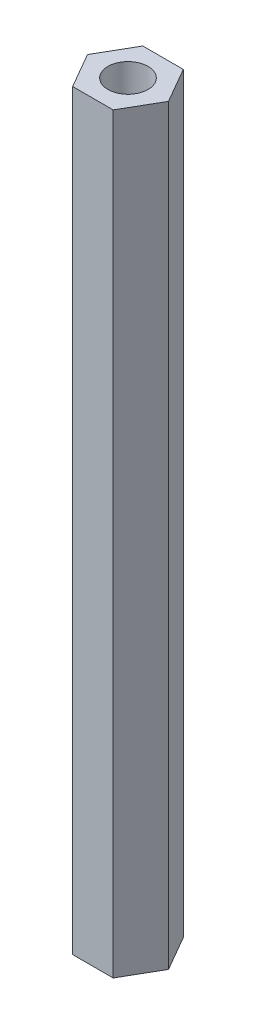
ISO-10303-21;
HEADER;
FILE_DESCRIPTION(('STEP AP214'),'2;1');
FILE_NAME('part.step','',(''),(''),'','','');
FILE_SCHEMA(('AUTOMOTIVE_DESIGN { 1 0 10303 214 1 1 1 1 }'));
ENDSEC;
DATA;
#1=APPLICATION_CONTEXT('core data for automotive mechanical design processes');
#2=APPLICATION_PROTOCOL_DEFINITION('international standard','automotive_design',2000,#1);
#3=PRODUCT_CONTEXT('',#1,'mechanical');
#4=PRODUCT('Part','Part','',(#3));
#5=PRODUCT_RELATED_PRODUCT_CATEGORY('part','',(#4));
#6=PRODUCT_DEFINITION_FORMATION('','',#4);
#7=PRODUCT_DEFINITION_CONTEXT('part definition',#1,'design');
#8=PRODUCT_DEFINITION('design','',#6,#7);
#9=PRODUCT_DEFINITION_SHAPE('','',#8);
#10=(LENGTH_UNIT() NAMED_UNIT(*) SI_UNIT(.MILLI.,.METRE.));
#11=(NAMED_UNIT(*) PLANE_ANGLE_UNIT() SI_UNIT($,.RADIAN.));
#12=(NAMED_UNIT(*) SI_UNIT($,.STERADIAN.) SOLID_ANGLE_UNIT());
#13=UNCERTAINTY_MEASURE_WITH_UNIT(LENGTH_MEASURE(1.E-05),#10,'distance_accuracy_value','');
#14=(GEOMETRIC_REPRESENTATION_CONTEXT(3) GLOBAL_UNCERTAINTY_ASSIGNED_CONTEXT((#13)) GLOBAL_UNIT_ASSIGNED_CONTEXT((#10,
#11,#12)) REPRESENTATION_CONTEXT('',''));
#15=CARTESIAN_POINT('',(0.,0.,0.));
#16=DIRECTION('',(0.,0.,1.));
#17=DIRECTION('',(1.,0.,0.));
#18=AXIS2_PLACEMENT_3D('',#15,#16,#17);
#19=CARTESIAN_POINT('',(0.,75.,0.));
#20=DIRECTION('',(0.,1.,0.));
#21=DIRECTION('',(0.,0.,1.));
#22=AXIS2_PLACEMENT_3D('',#19,#20,#21);
#23=PLANE('',#22);
#24=DIRECTION('',(-0.5,0.,-0.866025403784438));
#25=VECTOR('',#24,1.);
#26=CARTESIAN_POINT('',(4.04145188432738,75.,0.));
#27=LINE('',#26,#25);
#28=CARTESIAN_POINT('',(4.04145188432738,75.,0.));
#29=VERTEX_POINT('',#28);
#30=CARTESIAN_POINT('',(2.02072594216369,75.,-3.5));
#31=VERTEX_POINT('',#30);
#32=EDGE_CURVE('E154',#29,#31,#27,.T.);
#33=ORIENTED_EDGE('',*,*,#32,.T.);
#34=DIRECTION('',(-1.,0.,0.));
#35=VECTOR('',#34,1.);
#36=CARTESIAN_POINT('',(2.02072594216369,75.,-3.5));
#37=LINE('',#36,#35);
#38=CARTESIAN_POINT('',(-2.02072594216369,75.,-3.5));
#39=VERTEX_POINT('',#38);
#40=EDGE_CURVE('E102',#31,#39,#37,.T.);
#41=ORIENTED_EDGE('',*,*,#40,.T.);
#42=DIRECTION('',(-0.5,0.,0.866025403784439));
#43=VECTOR('',#42,1.);
#44=CARTESIAN_POINT('',(-2.02072594216369,75.,-3.5));
#45=LINE('',#44,#43);
#46=CARTESIAN_POINT('',(-4.04145188432738,75.,0.));
#47=VERTEX_POINT('',#46);
#48=EDGE_CURVE('E115',#39,#47,#45,.T.);
#49=ORIENTED_EDGE('',*,*,#48,.T.);
#50=DIRECTION('',(0.5,0.,0.866025403784439));
#51=VECTOR('',#50,1.);
#52=CARTESIAN_POINT('',(-4.04145188432738,75.,0.));
#53=LINE('',#52,#51);
#54=CARTESIAN_POINT('',(-2.02072594216368,75.,3.5));
#55=VERTEX_POINT('',#54);
#56=EDGE_CURVE('E109',#47,#55,#53,.T.);
#57=ORIENTED_EDGE('',*,*,#56,.T.);
#58=DIRECTION('',(1.,0.,0.));
#59=VECTOR('',#58,1.);
#60=CARTESIAN_POINT('',(-2.02072594216368,75.,3.5));
#61=LINE('',#60,#59);
#62=CARTESIAN_POINT('',(2.02072594216369,75.,3.5));
#63=VERTEX_POINT('',#62);
#64=EDGE_CURVE('E113',#55,#63,#61,.T.);
#65=ORIENTED_EDGE('',*,*,#64,.T.);
#66=DIRECTION('',(0.5,0.,-0.866025403784439));
#67=VECTOR('',#66,1.);
#68=CARTESIAN_POINT('',(2.02072594216369,75.,3.5));
#69=LINE('',#68,#67);
#70=EDGE_CURVE('E65',#63,#29,#69,.T.);
#71=ORIENTED_EDGE('',*,*,#70,.T.);
#72=EDGE_LOOP('',(#33,#41,#49,#57,#65,#71));
#73=FACE_BOUND('',#72,.T.);
#74=CARTESIAN_POINT('',(0.,75.,0.));
#75=DIRECTION('',(0.,1.,0.));
#76=DIRECTION('',(0.,0.,1.));
#77=AXIS2_PLACEMENT_3D('',#74,#75,#76);
#78=CIRCLE('',#77,2.);
#79=CARTESIAN_POINT('',(0.,75.,2.));
#80=VERTEX_POINT('',#79);
#81=EDGE_CURVE('E142',#80,#80,#78,.T.);
#82=ORIENTED_EDGE('',*,*,#81,.F.);
#83=EDGE_LOOP('',(#82));
#84=FACE_BOUND('',#83,.T.);
#85=ADVANCED_FACE('F47',(#73,#84),#23,.T.);
#86=CARTESIAN_POINT('',(0.,0.,0.));
#87=DIRECTION('',(0.,1.,0.));
#88=DIRECTION('',(0.,0.,1.));
#89=AXIS2_PLACEMENT_3D('',#86,#87,#88);
#90=PLANE('',#89);
#91=DIRECTION('',(-0.5,0.,-0.866025403784438));
#92=VECTOR('',#91,1.);
#93=CARTESIAN_POINT('',(4.04145188432738,0.,0.));
#94=LINE('',#93,#92);
#95=CARTESIAN_POINT('',(4.04145188432738,0.,0.));
#96=VERTEX_POINT('',#95);
#97=CARTESIAN_POINT('',(2.02072594216369,0.,-3.5));
#98=VERTEX_POINT('',#97);
#99=EDGE_CURVE('E137',#96,#98,#94,.T.);
#100=ORIENTED_EDGE('',*,*,#99,.F.);
#101=DIRECTION('',(0.5,0.,-0.866025403784439));
#102=VECTOR('',#101,1.);
#103=CARTESIAN_POINT('',(2.02072594216369,0.,3.5));
#104=LINE('',#103,#102);
#105=CARTESIAN_POINT('',(2.02072594216369,0.,3.5));
#106=VERTEX_POINT('',#105);
#107=EDGE_CURVE('E94',#106,#96,#104,.T.);
#108=ORIENTED_EDGE('',*,*,#107,.F.);
#109=DIRECTION('',(1.,0.,0.));
#110=VECTOR('',#109,1.);
#111=CARTESIAN_POINT('',(-2.02072594216368,0.,3.5));
#112=LINE('',#111,#110);
#113=CARTESIAN_POINT('',(-2.02072594216368,0.,3.5));
#114=VERTEX_POINT('',#113);
#115=EDGE_CURVE('E88',#114,#106,#112,.T.);
#116=ORIENTED_EDGE('',*,*,#115,.F.);
#117=DIRECTION('',(0.5,0.,0.866025403784439));
#118=VECTOR('',#117,1.);
#119=CARTESIAN_POINT('',(-4.04145188432738,0.,0.));
#120=LINE('',#119,#118);
#121=CARTESIAN_POINT('',(-4.04145188432738,0.,0.));
#122=VERTEX_POINT('',#121);
#123=EDGE_CURVE('E124',#122,#114,#120,.T.);
#124=ORIENTED_EDGE('',*,*,#123,.F.);
#125=DIRECTION('',(-0.5,0.,0.866025403784439));
#126=VECTOR('',#125,1.);
#127=CARTESIAN_POINT('',(-2.02072594216369,0.,-3.5));
#128=LINE('',#127,#126);
#129=CARTESIAN_POINT('',(-2.02072594216369,0.,-3.5));
#130=VERTEX_POINT('',#129);
#131=EDGE_CURVE('E145',#130,#122,#128,.T.);
#132=ORIENTED_EDGE('',*,*,#131,.F.);
#133=DIRECTION('',(-1.,0.,0.));
#134=VECTOR('',#133,1.);
#135=CARTESIAN_POINT('',(2.02072594216369,0.,-3.5));
#136=LINE('',#135,#134);
#137=EDGE_CURVE('E141',#98,#130,#136,.T.);
#138=ORIENTED_EDGE('',*,*,#137,.F.);
#139=EDGE_LOOP('',(#100,#108,#116,#124,#132,#138));
#140=FACE_BOUND('',#139,.T.);
#141=CARTESIAN_POINT('',(0.,0.,0.));
#142=DIRECTION('',(0.,1.,0.));
#143=DIRECTION('',(0.,0.,1.));
#144=AXIS2_PLACEMENT_3D('',#141,#142,#143);
#145=CIRCLE('',#144,2.);
#146=CARTESIAN_POINT('',(0.,0.,2.));
#147=VERTEX_POINT('',#146);
#148=EDGE_CURVE('E253',#147,#147,#145,.T.);
#149=ORIENTED_EDGE('',*,*,#148,.T.);
#150=EDGE_LOOP('',(#149));
#151=FACE_BOUND('',#150,.T.);
#152=ADVANCED_FACE('F167',(#140,#151),#90,.F.);
#153=CARTESIAN_POINT('',(4.04145188432738,75.,0.));
#154=DIRECTION('',(-0.866025403784438,0.,0.5));
#155=DIRECTION('',(0.5,0.,0.866025403784439));
#156=AXIS2_PLACEMENT_3D('',#153,#154,#155);
#157=PLANE('',#156);
#158=ORIENTED_EDGE('',*,*,#99,.T.);
#159=DIRECTION('',(0.,-1.,0.));
#160=VECTOR('',#159,1.);
#161=CARTESIAN_POINT('',(2.02072594216369,75.,-3.5));
#162=LINE('',#161,#160);
#163=EDGE_CURVE('E11',#31,#98,#162,.T.);
#164=ORIENTED_EDGE('',*,*,#163,.F.);
#165=ORIENTED_EDGE('',*,*,#32,.F.);
#166=DIRECTION('',(0.,-1.,0.));
#167=VECTOR('',#166,1.);
#168=CARTESIAN_POINT('',(4.04145188432738,75.,0.));
#169=LINE('',#168,#167);
#170=EDGE_CURVE('E133',#29,#96,#169,.T.);
#171=ORIENTED_EDGE('',*,*,#170,.T.);
#172=EDGE_LOOP('',(#158,#164,#165,#171));
#173=FACE_BOUND('',#172,.T.);
#174=ADVANCED_FACE('F49',(#173),#157,.F.);
#175=CARTESIAN_POINT('',(2.02072594216369,75.,-3.5));
#176=DIRECTION('',(0.,0.,1.));
#177=DIRECTION('',(1.,0.,0.));
#178=AXIS2_PLACEMENT_3D('',#175,#176,#177);
#179=PLANE('',#178);
#180=ORIENTED_EDGE('',*,*,#137,.T.);
#181=DIRECTION('',(0.,-1.,0.));
#182=VECTOR('',#181,1.);
#183=CARTESIAN_POINT('',(-2.02072594216369,75.,-3.5));
#184=LINE('',#183,#182);
#185=EDGE_CURVE('E57',#39,#130,#184,.T.);
#186=ORIENTED_EDGE('',*,*,#185,.F.);
#187=ORIENTED_EDGE('',*,*,#40,.F.);
#188=ORIENTED_EDGE('',*,*,#163,.T.);
#189=EDGE_LOOP('',(#180,#186,#187,#188));
#190=FACE_BOUND('',#189,.T.);
#191=ADVANCED_FACE('F192',(#190),#179,.F.);
#192=CARTESIAN_POINT('',(-2.02072594216369,75.,-3.5));
#193=DIRECTION('',(0.866025403784439,0.,0.5));
#194=DIRECTION('',(0.5,0.,-0.866025403784439));
#195=AXIS2_PLACEMENT_3D('',#192,#193,#194);
#196=PLANE('',#195);
#197=ORIENTED_EDGE('',*,*,#131,.T.);
#198=DIRECTION('',(0.,-1.,0.));
#199=VECTOR('',#198,1.);
#200=CARTESIAN_POINT('',(-4.04145188432738,75.,0.));
#201=LINE('',#200,#199);
#202=EDGE_CURVE('E126',#47,#122,#201,.T.);
#203=ORIENTED_EDGE('',*,*,#202,.F.);
#204=ORIENTED_EDGE('',*,*,#48,.F.);
#205=ORIENTED_EDGE('',*,*,#185,.T.);
#206=EDGE_LOOP('',(#197,#203,#204,#205));
#207=FACE_BOUND('',#206,.T.);
#208=ADVANCED_FACE('F164',(#207),#196,.F.);
#209=CARTESIAN_POINT('',(-4.04145188432738,75.,0.));
#210=DIRECTION('',(0.866025403784439,0.,-0.5));
#211=DIRECTION('',(-0.5,0.,-0.866025403784439));
#212=AXIS2_PLACEMENT_3D('',#209,#210,#211);
#213=PLANE('',#212);
#214=ORIENTED_EDGE('',*,*,#123,.T.);
#215=DIRECTION('',(0.,-1.,0.));
#216=VECTOR('',#215,1.);
#217=CARTESIAN_POINT('',(-2.02072594216368,75.,3.5));
#218=LINE('',#217,#216);
#219=EDGE_CURVE('E121',#55,#114,#218,.T.);
#220=ORIENTED_EDGE('',*,*,#219,.F.);
#221=ORIENTED_EDGE('',*,*,#56,.F.);
#222=ORIENTED_EDGE('',*,*,#202,.T.);
#223=EDGE_LOOP('',(#214,#220,#221,#222));
#224=FACE_BOUND('',#223,.T.);
#225=ADVANCED_FACE('F122',(#224),#213,.F.);
#226=CARTESIAN_POINT('',(-2.02072594216368,75.,3.5));
#227=DIRECTION('',(0.,0.,-1.));
#228=DIRECTION('',(-1.,0.,0.));
#229=AXIS2_PLACEMENT_3D('',#226,#227,#228);
#230=PLANE('',#229);
#231=ORIENTED_EDGE('',*,*,#115,.T.);
#232=DIRECTION('',(0.,-1.,0.));
#233=VECTOR('',#232,1.);
#234=CARTESIAN_POINT('',(2.02072594216369,75.,3.5));
#235=LINE('',#234,#233);
#236=EDGE_CURVE('E127',#63,#106,#235,.T.);
#237=ORIENTED_EDGE('',*,*,#236,.F.);
#238=ORIENTED_EDGE('',*,*,#64,.F.);
#239=ORIENTED_EDGE('',*,*,#219,.T.);
#240=EDGE_LOOP('',(#231,#237,#238,#239));
#241=FACE_BOUND('',#240,.T.);
#242=ADVANCED_FACE('F129',(#241),#230,.F.);
#243=CARTESIAN_POINT('',(2.02072594216369,75.,3.5));
#244=DIRECTION('',(-0.866025403784439,0.,-0.5));
#245=DIRECTION('',(-0.5,0.,0.866025403784439));
#246=AXIS2_PLACEMENT_3D('',#243,#244,#245);
#247=PLANE('',#246);
#248=ORIENTED_EDGE('',*,*,#107,.T.);
#249=ORIENTED_EDGE('',*,*,#170,.F.);
#250=ORIENTED_EDGE('',*,*,#70,.F.);
#251=ORIENTED_EDGE('',*,*,#236,.T.);
#252=EDGE_LOOP('',(#248,#249,#250,#251));
#253=FACE_BOUND('',#252,.T.);
#254=ADVANCED_FACE('F172',(#253),#247,.F.);
#255=CARTESIAN_POINT('',(0.,75.,0.));
#256=DIRECTION('',(0.,-1.,0.));
#257=DIRECTION('',(0.,0.,-1.));
#258=AXIS2_PLACEMENT_3D('',#255,#256,#257);
#259=CYLINDRICAL_SURFACE('',#258,2.);
#260=ORIENTED_EDGE('',*,*,#81,.T.);
#261=EDGE_LOOP('',(#260));
#262=FACE_BOUND('',#261,.T.);
#263=ORIENTED_EDGE('',*,*,#148,.F.);
#264=EDGE_LOOP('',(#263));
#265=FACE_BOUND('',#264,.T.);
#266=ADVANCED_FACE('F174',(#262,#265),#259,.F.);
#267=CLOSED_SHELL('',(#85,#152,#174,#191,#208,#225,#242,#254,#266));
#268=MANIFOLD_SOLID_BREP('B2',#267);
#269=ADVANCED_BREP_SHAPE_REPRESENTATION('',(#18,#268),#14);
#270=SHAPE_DEFINITION_REPRESENTATION(#9,#269);
ENDSEC;
END-ISO-10303-21;
